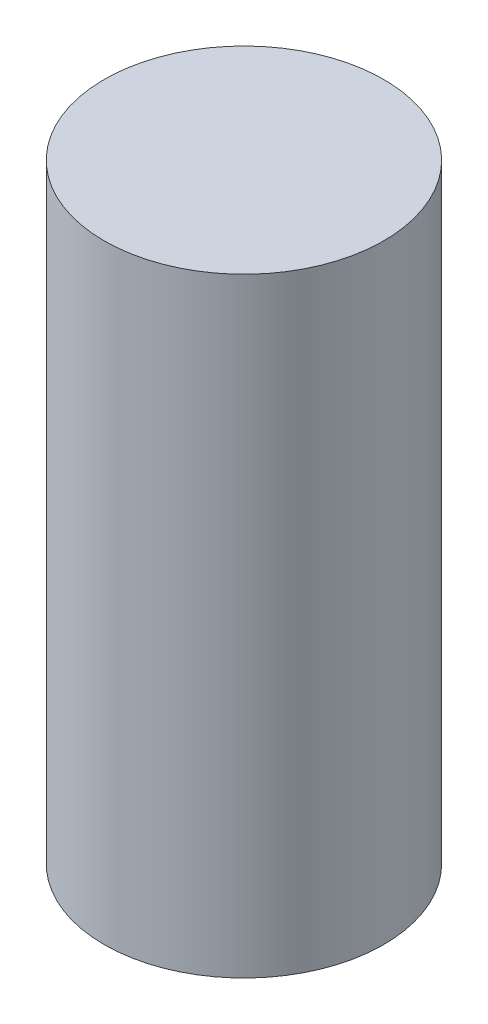
ISO-10303-21;
HEADER;
FILE_DESCRIPTION(('STEP AP214'),'2;1');
FILE_NAME('part.step','',(''),(''),'','','');
FILE_SCHEMA(('AUTOMOTIVE_DESIGN { 1 0 10303 214 1 1 1 1 }'));
ENDSEC;
DATA;
#1=APPLICATION_CONTEXT('core data for automotive mechanical design processes');
#2=APPLICATION_PROTOCOL_DEFINITION('international standard','automotive_design',2000,#1);
#3=PRODUCT_CONTEXT('',#1,'mechanical');
#4=PRODUCT('Part','Part','',(#3));
#5=PRODUCT_RELATED_PRODUCT_CATEGORY('part','',(#4));
#6=PRODUCT_DEFINITION_FORMATION('','',#4);
#7=PRODUCT_DEFINITION_CONTEXT('part definition',#1,'design');
#8=PRODUCT_DEFINITION('design','',#6,#7);
#9=PRODUCT_DEFINITION_SHAPE('','',#8);
#10=(LENGTH_UNIT() NAMED_UNIT(*) SI_UNIT(.MILLI.,.METRE.));
#11=(NAMED_UNIT(*) PLANE_ANGLE_UNIT() SI_UNIT($,.RADIAN.));
#12=(NAMED_UNIT(*) SI_UNIT($,.STERADIAN.) SOLID_ANGLE_UNIT());
#13=UNCERTAINTY_MEASURE_WITH_UNIT(LENGTH_MEASURE(1.E-05),#10,'distance_accuracy_value','');
#14=(GEOMETRIC_REPRESENTATION_CONTEXT(3) GLOBAL_UNCERTAINTY_ASSIGNED_CONTEXT((#13)) GLOBAL_UNIT_ASSIGNED_CONTEXT((#10,
#11,#12)) REPRESENTATION_CONTEXT('',''));
#15=CARTESIAN_POINT('',(0.,0.,0.));
#16=DIRECTION('',(0.,0.,1.));
#17=DIRECTION('',(1.,0.,0.));
#18=AXIS2_PLACEMENT_3D('',#15,#16,#17);
#19=CARTESIAN_POINT('',(0.,2.7686,0.));
#20=DIRECTION('',(0.,-1.,0.));
#21=DIRECTION('',(0.,0.,-1.));
#22=AXIS2_PLACEMENT_3D('',#19,#20,#21);
#23=CYLINDRICAL_SURFACE('',#22,0.635);
#24=CARTESIAN_POINT('',(0.,2.7686,0.));
#25=DIRECTION('',(0.,1.,0.));
#26=DIRECTION('',(0.,0.,1.));
#27=AXIS2_PLACEMENT_3D('',#24,#25,#26);
#28=CIRCLE('',#27,0.635);
#29=CARTESIAN_POINT('',(0.,2.7686,0.635));
#30=VERTEX_POINT('',#29);
#31=EDGE_CURVE('E10',#30,#30,#28,.T.);
#32=ORIENTED_EDGE('',*,*,#31,.F.);
#33=EDGE_LOOP('',(#32));
#34=FACE_BOUND('',#33,.T.);
#35=CARTESIAN_POINT('',(0.,0.,0.));
#36=DIRECTION('',(0.,1.,0.));
#37=DIRECTION('',(0.,0.,1.));
#38=AXIS2_PLACEMENT_3D('',#35,#36,#37);
#39=CIRCLE('',#38,0.635);
#40=CARTESIAN_POINT('',(0.,0.,0.635));
#41=VERTEX_POINT('',#40);
#42=EDGE_CURVE('E42',#41,#41,#39,.T.);
#43=ORIENTED_EDGE('',*,*,#42,.T.);
#44=EDGE_LOOP('',(#43));
#45=FACE_BOUND('',#44,.T.);
#46=ADVANCED_FACE('F39',(#34,#45),#23,.T.);
#47=CARTESIAN_POINT('',(0.,2.7686,0.));
#48=DIRECTION('',(0.,1.,0.));
#49=DIRECTION('',(0.,0.,1.));
#50=AXIS2_PLACEMENT_3D('',#47,#48,#49);
#51=PLANE('',#50);
#52=ORIENTED_EDGE('',*,*,#31,.T.);
#53=EDGE_LOOP('',(#52));
#54=FACE_BOUND('',#53,.T.);
#55=ADVANCED_FACE('F56',(#54),#51,.T.);
#56=CARTESIAN_POINT('',(0.,0.,0.));
#57=DIRECTION('',(0.,1.,0.));
#58=DIRECTION('',(0.,0.,1.));
#59=AXIS2_PLACEMENT_3D('',#56,#57,#58);
#60=PLANE('',#59);
#61=ORIENTED_EDGE('',*,*,#42,.F.);
#62=EDGE_LOOP('',(#61));
#63=FACE_BOUND('',#62,.T.);
#64=ADVANCED_FACE('F54',(#63),#60,.F.);
#65=CLOSED_SHELL('',(#46,#55,#64));
#66=MANIFOLD_SOLID_BREP('B2',#65);
#67=ADVANCED_BREP_SHAPE_REPRESENTATION('',(#18,#66),#14);
#68=SHAPE_DEFINITION_REPRESENTATION(#9,#67);
ENDSEC;
END-ISO-10303-21;
